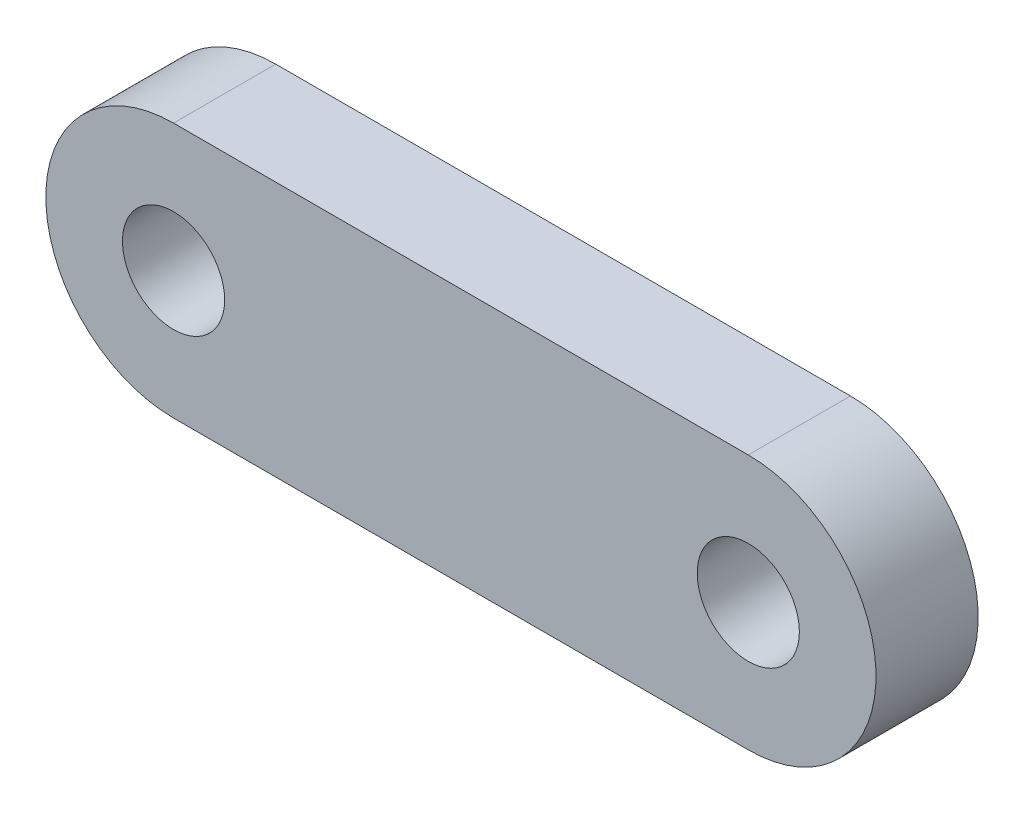
ISO-10303-21;
HEADER;
FILE_DESCRIPTION(('STEP AP214'),'2;1');
FILE_NAME('part.step','',(''),(''),'','','');
FILE_SCHEMA(('AUTOMOTIVE_DESIGN { 1 0 10303 214 1 1 1 1 }'));
ENDSEC;
DATA;
#1=APPLICATION_CONTEXT('core data for automotive mechanical design processes');
#2=APPLICATION_PROTOCOL_DEFINITION('international standard','automotive_design',2000,#1);
#3=PRODUCT_CONTEXT('',#1,'mechanical');
#4=PRODUCT('Part','Part','',(#3));
#5=PRODUCT_RELATED_PRODUCT_CATEGORY('part','',(#4));
#6=PRODUCT_DEFINITION_FORMATION('','',#4);
#7=PRODUCT_DEFINITION_CONTEXT('part definition',#1,'design');
#8=PRODUCT_DEFINITION('design','',#6,#7);
#9=PRODUCT_DEFINITION_SHAPE('','',#8);
#10=(LENGTH_UNIT() NAMED_UNIT(*) SI_UNIT(.MILLI.,.METRE.));
#11=(NAMED_UNIT(*) PLANE_ANGLE_UNIT() SI_UNIT($,.RADIAN.));
#12=(NAMED_UNIT(*) SI_UNIT($,.STERADIAN.) SOLID_ANGLE_UNIT());
#13=UNCERTAINTY_MEASURE_WITH_UNIT(LENGTH_MEASURE(1.E-05),#10,'distance_accuracy_value','');
#14=(GEOMETRIC_REPRESENTATION_CONTEXT(3) GLOBAL_UNCERTAINTY_ASSIGNED_CONTEXT((#13)) GLOBAL_UNIT_ASSIGNED_CONTEXT((#10,
#11,#12)) REPRESENTATION_CONTEXT('',''));
#15=CARTESIAN_POINT('',(0.,0.,0.));
#16=DIRECTION('',(0.,0.,1.));
#17=DIRECTION('',(1.,0.,0.));
#18=AXIS2_PLACEMENT_3D('',#15,#16,#17);
#19=CARTESIAN_POINT('',(0.,-3.175,2.54));
#20=DIRECTION('',(0.,1.,0.));
#21=DIRECTION('',(0.,0.,1.));
#22=AXIS2_PLACEMENT_3D('',#19,#20,#21);
#23=PLANE('',#22);
#24=DIRECTION('',(1.,0.,0.));
#25=VECTOR('',#24,1.);
#26=CARTESIAN_POINT('',(0.,-3.175,0.));
#27=LINE('',#26,#25);
#28=CARTESIAN_POINT('',(0.,-3.175,0.));
#29=VERTEX_POINT('',#28);
#30=CARTESIAN_POINT('',(14.2875,-3.175,0.));
#31=VERTEX_POINT('',#30);
#32=EDGE_CURVE('E117',#29,#31,#27,.T.);
#33=ORIENTED_EDGE('',*,*,#32,.T.);
#34=DIRECTION('',(0.,0.,-1.));
#35=VECTOR('',#34,1.);
#36=CARTESIAN_POINT('',(14.2875,-3.175,2.54));
#37=LINE('',#36,#35);
#38=CARTESIAN_POINT('',(14.2875,-3.175,2.54));
#39=VERTEX_POINT('',#38);
#40=EDGE_CURVE('E11',#39,#31,#37,.T.);
#41=ORIENTED_EDGE('',*,*,#40,.F.);
#42=DIRECTION('',(1.,0.,0.));
#43=VECTOR('',#42,1.);
#44=CARTESIAN_POINT('',(0.,-3.175,2.54));
#45=LINE('',#44,#43);
#46=CARTESIAN_POINT('',(0.,-3.175,2.54));
#47=VERTEX_POINT('',#46);
#48=EDGE_CURVE('E90',#47,#39,#45,.T.);
#49=ORIENTED_EDGE('',*,*,#48,.F.);
#50=DIRECTION('',(0.,0.,-1.));
#51=VECTOR('',#50,1.);
#52=CARTESIAN_POINT('',(0.,-3.175,2.54));
#53=LINE('',#52,#51);
#54=EDGE_CURVE('E116',#47,#29,#53,.T.);
#55=ORIENTED_EDGE('',*,*,#54,.T.);
#56=EDGE_LOOP('',(#33,#41,#49,#55));
#57=FACE_BOUND('',#56,.T.);
#58=ADVANCED_FACE('F41',(#57),#23,.F.);
#59=CARTESIAN_POINT('',(14.2875,0.,2.54));
#60=DIRECTION('',(0.,0.,-1.));
#61=DIRECTION('',(-1.,0.,0.));
#62=AXIS2_PLACEMENT_3D('',#59,#60,#61);
#63=CYLINDRICAL_SURFACE('',#62,3.175);
#64=CARTESIAN_POINT('',(14.2875,0.,0.));
#65=DIRECTION('',(0.,0.,1.));
#66=DIRECTION('',(1.,0.,0.));
#67=AXIS2_PLACEMENT_3D('',#64,#65,#66);
#68=CIRCLE('',#67,3.175);
#69=CARTESIAN_POINT('',(14.2875,3.175,0.));
#70=VERTEX_POINT('',#69);
#71=EDGE_CURVE('E96',#31,#70,#68,.T.);
#72=ORIENTED_EDGE('',*,*,#71,.T.);
#73=DIRECTION('',(0.,0.,-1.));
#74=VECTOR('',#73,1.);
#75=CARTESIAN_POINT('',(14.2875,3.175,2.54));
#76=LINE('',#75,#74);
#77=CARTESIAN_POINT('',(14.2875,3.175,2.54));
#78=VERTEX_POINT('',#77);
#79=EDGE_CURVE('E50',#78,#70,#76,.T.);
#80=ORIENTED_EDGE('',*,*,#79,.F.);
#81=CARTESIAN_POINT('',(14.2875,0.,2.54));
#82=DIRECTION('',(0.,0.,1.));
#83=DIRECTION('',(1.,0.,0.));
#84=AXIS2_PLACEMENT_3D('',#81,#82,#83);
#85=CIRCLE('',#84,3.175);
#86=EDGE_CURVE('E84',#39,#78,#85,.T.);
#87=ORIENTED_EDGE('',*,*,#86,.F.);
#88=ORIENTED_EDGE('',*,*,#40,.T.);
#89=EDGE_LOOP('',(#72,#80,#87,#88));
#90=FACE_BOUND('',#89,.T.);
#91=ADVANCED_FACE('F95',(#90),#63,.T.);
#92=CARTESIAN_POINT('',(0.,3.175,2.54));
#93=DIRECTION('',(0.,1.,0.));
#94=DIRECTION('',(0.,0.,1.));
#95=AXIS2_PLACEMENT_3D('',#92,#93,#94);
#96=PLANE('',#95);
#97=DIRECTION('',(1.,0.,0.));
#98=VECTOR('',#97,1.);
#99=CARTESIAN_POINT('',(0.,3.175,0.));
#100=LINE('',#99,#98);
#101=CARTESIAN_POINT('',(0.,3.175,0.));
#102=VERTEX_POINT('',#101);
#103=EDGE_CURVE('E123',#102,#70,#100,.T.);
#104=ORIENTED_EDGE('',*,*,#103,.F.);
#105=DIRECTION('',(0.,0.,-1.));
#106=VECTOR('',#105,1.);
#107=CARTESIAN_POINT('',(0.,3.175,2.54));
#108=LINE('',#107,#106);
#109=CARTESIAN_POINT('',(0.,3.175,2.54));
#110=VERTEX_POINT('',#109);
#111=EDGE_CURVE('E74',#110,#102,#108,.T.);
#112=ORIENTED_EDGE('',*,*,#111,.F.);
#113=DIRECTION('',(1.,0.,0.));
#114=VECTOR('',#113,1.);
#115=CARTESIAN_POINT('',(0.,3.175,2.54));
#116=LINE('',#115,#114);
#117=EDGE_CURVE('E88',#110,#78,#116,.T.);
#118=ORIENTED_EDGE('',*,*,#117,.T.);
#119=ORIENTED_EDGE('',*,*,#79,.T.);
#120=EDGE_LOOP('',(#104,#112,#118,#119));
#121=FACE_BOUND('',#120,.T.);
#122=ADVANCED_FACE('F101',(#121),#96,.T.);
#123=CARTESIAN_POINT('',(0.,0.,2.54));
#124=DIRECTION('',(0.,0.,-1.));
#125=DIRECTION('',(-1.,0.,0.));
#126=AXIS2_PLACEMENT_3D('',#123,#124,#125);
#127=CYLINDRICAL_SURFACE('',#126,1.27);
#128=CARTESIAN_POINT('',(0.,0.,2.54));
#129=DIRECTION('',(0.,0.,1.));
#130=DIRECTION('',(1.,0.,0.));
#131=AXIS2_PLACEMENT_3D('',#128,#129,#130);
#132=CIRCLE('',#131,1.27);
#133=CARTESIAN_POINT('',(1.27,0.,2.54));
#134=VERTEX_POINT('',#133);
#135=EDGE_CURVE('E105',#134,#134,#132,.T.);
#136=ORIENTED_EDGE('',*,*,#135,.T.);
#137=EDGE_LOOP('',(#136));
#138=FACE_BOUND('',#137,.T.);
#139=CARTESIAN_POINT('',(0.,0.,0.));
#140=DIRECTION('',(0.,0.,1.));
#141=DIRECTION('',(1.,0.,0.));
#142=AXIS2_PLACEMENT_3D('',#139,#140,#141);
#143=CIRCLE('',#142,1.27);
#144=CARTESIAN_POINT('',(1.27,0.,0.));
#145=VERTEX_POINT('',#144);
#146=EDGE_CURVE('E128',#145,#145,#143,.T.);
#147=ORIENTED_EDGE('',*,*,#146,.F.);
#148=EDGE_LOOP('',(#147));
#149=FACE_BOUND('',#148,.T.);
#150=ADVANCED_FACE('F160',(#138,#149),#127,.F.);
#151=CARTESIAN_POINT('',(0.,0.,2.54));
#152=DIRECTION('',(0.,0.,-1.));
#153=DIRECTION('',(-1.,0.,0.));
#154=AXIS2_PLACEMENT_3D('',#151,#152,#153);
#155=CYLINDRICAL_SURFACE('',#154,3.175);
#156=CARTESIAN_POINT('',(0.,0.,0.));
#157=DIRECTION('',(0.,0.,1.));
#158=DIRECTION('',(1.,0.,0.));
#159=AXIS2_PLACEMENT_3D('',#156,#157,#158);
#160=CIRCLE('',#159,3.175);
#161=EDGE_CURVE('E77',#102,#29,#160,.T.);
#162=ORIENTED_EDGE('',*,*,#161,.T.);
#163=ORIENTED_EDGE('',*,*,#54,.F.);
#164=CARTESIAN_POINT('',(0.,0.,2.54));
#165=DIRECTION('',(0.,0.,1.));
#166=DIRECTION('',(1.,0.,0.));
#167=AXIS2_PLACEMENT_3D('',#164,#165,#166);
#168=CIRCLE('',#167,3.175);
#169=EDGE_CURVE('E58',#110,#47,#168,.T.);
#170=ORIENTED_EDGE('',*,*,#169,.F.);
#171=ORIENTED_EDGE('',*,*,#111,.T.);
#172=EDGE_LOOP('',(#162,#163,#170,#171));
#173=FACE_BOUND('',#172,.T.);
#174=ADVANCED_FACE('F152',(#173),#155,.T.);
#175=CARTESIAN_POINT('',(14.2875,0.,2.54));
#176=DIRECTION('',(0.,0.,-1.));
#177=DIRECTION('',(-1.,0.,0.));
#178=AXIS2_PLACEMENT_3D('',#175,#176,#177);
#179=CYLINDRICAL_SURFACE('',#178,1.27);
#180=CARTESIAN_POINT('',(14.2875,0.,2.54));
#181=DIRECTION('',(0.,0.,1.));
#182=DIRECTION('',(1.,0.,0.));
#183=AXIS2_PLACEMENT_3D('',#180,#181,#182);
#184=CIRCLE('',#183,1.27);
#185=CARTESIAN_POINT('',(15.5575,0.,2.54));
#186=VERTEX_POINT('',#185);
#187=EDGE_CURVE('E112',#186,#186,#184,.T.);
#188=ORIENTED_EDGE('',*,*,#187,.T.);
#189=EDGE_LOOP('',(#188));
#190=FACE_BOUND('',#189,.T.);
#191=CARTESIAN_POINT('',(14.2875,0.,0.));
#192=DIRECTION('',(0.,0.,1.));
#193=DIRECTION('',(1.,0.,0.));
#194=AXIS2_PLACEMENT_3D('',#191,#192,#193);
#195=CIRCLE('',#194,1.27);
#196=CARTESIAN_POINT('',(15.5575,0.,0.));
#197=VERTEX_POINT('',#196);
#198=EDGE_CURVE('E132',#197,#197,#195,.T.);
#199=ORIENTED_EDGE('',*,*,#198,.F.);
#200=EDGE_LOOP('',(#199));
#201=FACE_BOUND('',#200,.T.);
#202=ADVANCED_FACE('F150',(#190,#201),#179,.F.);
#203=CARTESIAN_POINT('',(0.,0.,2.54));
#204=DIRECTION('',(0.,0.,1.));
#205=DIRECTION('',(1.,0.,0.));
#206=AXIS2_PLACEMENT_3D('',#203,#204,#205);
#207=PLANE('',#206);
#208=ORIENTED_EDGE('',*,*,#48,.T.);
#209=ORIENTED_EDGE('',*,*,#86,.T.);
#210=ORIENTED_EDGE('',*,*,#117,.F.);
#211=ORIENTED_EDGE('',*,*,#169,.T.);
#212=EDGE_LOOP('',(#208,#209,#210,#211));
#213=FACE_BOUND('',#212,.T.);
#214=ORIENTED_EDGE('',*,*,#135,.F.);
#215=EDGE_LOOP('',(#214));
#216=FACE_BOUND('',#215,.T.);
#217=ORIENTED_EDGE('',*,*,#187,.F.);
#218=EDGE_LOOP('',(#217));
#219=FACE_BOUND('',#218,.T.);
#220=ADVANCED_FACE('F85',(#213,#216,#219),#207,.T.);
#221=CARTESIAN_POINT('',(0.,0.,0.));
#222=DIRECTION('',(0.,0.,1.));
#223=DIRECTION('',(1.,0.,0.));
#224=AXIS2_PLACEMENT_3D('',#221,#222,#223);
#225=PLANE('',#224);
#226=ORIENTED_EDGE('',*,*,#32,.F.);
#227=ORIENTED_EDGE('',*,*,#161,.F.);
#228=ORIENTED_EDGE('',*,*,#103,.T.);
#229=ORIENTED_EDGE('',*,*,#71,.F.);
#230=EDGE_LOOP('',(#226,#227,#228,#229));
#231=FACE_BOUND('',#230,.T.);
#232=ORIENTED_EDGE('',*,*,#146,.T.);
#233=EDGE_LOOP('',(#232));
#234=FACE_BOUND('',#233,.T.);
#235=ORIENTED_EDGE('',*,*,#198,.T.);
#236=EDGE_LOOP('',(#235));
#237=FACE_BOUND('',#236,.T.);
#238=ADVANCED_FACE('F142',(#231,#234,#237),#225,.F.);
#239=CLOSED_SHELL('',(#58,#91,#122,#150,#174,#202,#220,#238));
#240=MANIFOLD_SOLID_BREP('B2',#239);
#241=ADVANCED_BREP_SHAPE_REPRESENTATION('',(#18,#240),#14);
#242=SHAPE_DEFINITION_REPRESENTATION(#9,#241);
ENDSEC;
END-ISO-10303-21;
